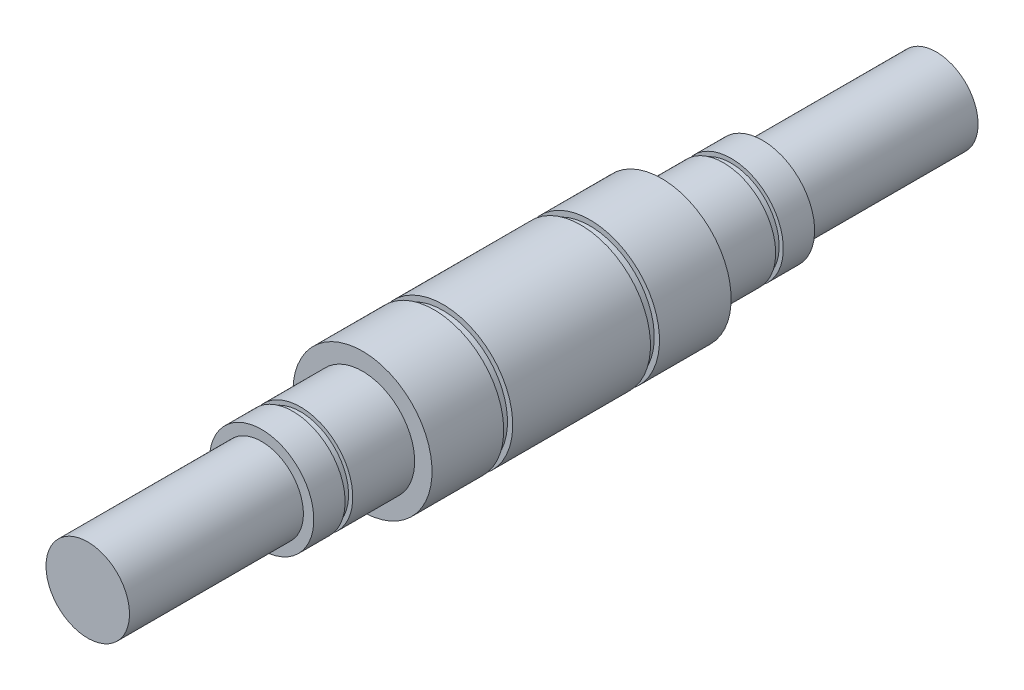
ISO-10303-21;
HEADER;
FILE_DESCRIPTION(('STEP AP214'),'2;1');
FILE_NAME('part.step','',(''),(''),'','','');
FILE_SCHEMA(('AUTOMOTIVE_DESIGN { 1 0 10303 214 1 1 1 1 }'));
ENDSEC;
DATA;
#1=APPLICATION_CONTEXT('core data for automotive mechanical design processes');
#2=APPLICATION_PROTOCOL_DEFINITION('international standard','automotive_design',2000,#1);
#3=PRODUCT_CONTEXT('',#1,'mechanical');
#4=PRODUCT('Part','Part','',(#3));
#5=PRODUCT_RELATED_PRODUCT_CATEGORY('part','',(#4));
#6=PRODUCT_DEFINITION_FORMATION('','',#4);
#7=PRODUCT_DEFINITION_CONTEXT('part definition',#1,'design');
#8=PRODUCT_DEFINITION('design','',#6,#7);
#9=PRODUCT_DEFINITION_SHAPE('','',#8);
#10=(LENGTH_UNIT() NAMED_UNIT(*) SI_UNIT(.MILLI.,.METRE.));
#11=(NAMED_UNIT(*) PLANE_ANGLE_UNIT() SI_UNIT($,.RADIAN.));
#12=(NAMED_UNIT(*) SI_UNIT($,.STERADIAN.) SOLID_ANGLE_UNIT());
#13=UNCERTAINTY_MEASURE_WITH_UNIT(LENGTH_MEASURE(1.E-05),#10,'distance_accuracy_value','');
#14=(GEOMETRIC_REPRESENTATION_CONTEXT(3) GLOBAL_UNCERTAINTY_ASSIGNED_CONTEXT((#13)) GLOBAL_UNIT_ASSIGNED_CONTEXT((#10,
#11,#12)) REPRESENTATION_CONTEXT('',''));
#15=CARTESIAN_POINT('',(0.,0.,0.));
#16=DIRECTION('',(0.,0.,1.));
#17=DIRECTION('',(1.,0.,0.));
#18=AXIS2_PLACEMENT_3D('',#15,#16,#17);
#19=CARTESIAN_POINT('',(0.,0.,61.));
#20=DIRECTION('',(0.,0.,-1.));
#21=DIRECTION('',(-1.,0.,0.));
#22=AXIS2_PLACEMENT_3D('',#19,#20,#21);
#23=CYLINDRICAL_SURFACE('',#22,10.);
#24=CARTESIAN_POINT('',(0.,0.,9.9));
#25=DIRECTION('',(0.,0.,-1.));
#26=DIRECTION('',(-1.,0.,0.));
#27=AXIS2_PLACEMENT_3D('',#24,#25,#26);
#28=CIRCLE('',#27,10.);
#29=CARTESIAN_POINT('',(-10.,0.,9.9));
#30=VERTEX_POINT('',#29);
#31=EDGE_CURVE('E113',#30,#30,#28,.T.);
#32=CARTESIAN_POINT('',(0.,0.,-9.9));
#33=DIRECTION('',(0.,0.,-1.));
#34=DIRECTION('',(-1.,0.,0.));
#35=AXIS2_PLACEMENT_3D('',#32,#33,#34);
#36=CIRCLE('',#35,10.);
#37=CARTESIAN_POINT('',(-10.,0.,-9.90000000000001));
#38=VERTEX_POINT('',#37);
#39=EDGE_CURVE('E101',#38,#38,#36,.T.);
#40=CARTESIAN_POINT('',(-10.,0.,9.9));
#41=CARTESIAN_POINT('',(-10.,0.,9.69375));
#42=CARTESIAN_POINT('',(-10.,0.,9.4875));
#43=CARTESIAN_POINT('',(-10.,0.,9.075));
#44=CARTESIAN_POINT('',(-10.,0.,8.86875));
#45=CARTESIAN_POINT('',(-10.,0.,8.45625));
#46=CARTESIAN_POINT('',(-10.,0.,8.24999999999999));
#47=CARTESIAN_POINT('',(-10.,0.,7.8375));
#48=CARTESIAN_POINT('',(-10.,0.,7.63125));
#49=CARTESIAN_POINT('',(-10.,0.,7.21875));
#50=CARTESIAN_POINT('',(-10.,0.,7.0125));
#51=CARTESIAN_POINT('',(-10.,0.,6.6));
#52=CARTESIAN_POINT('',(-10.,0.,6.39375));
#53=CARTESIAN_POINT('',(-10.,0.,5.98125));
#54=CARTESIAN_POINT('',(-10.,0.,5.775));
#55=CARTESIAN_POINT('',(-10.,0.,5.3625));
#56=CARTESIAN_POINT('',(-10.,0.,5.15625));
#57=CARTESIAN_POINT('',(-10.,0.,4.74375));
#58=CARTESIAN_POINT('',(-10.,0.,4.5375));
#59=CARTESIAN_POINT('',(-10.,0.,4.12499999999999));
#60=CARTESIAN_POINT('',(-10.,0.,3.91874999999999));
#61=CARTESIAN_POINT('',(-10.,0.,3.50624999999999));
#62=CARTESIAN_POINT('',(-10.,0.,3.29999999999999));
#63=CARTESIAN_POINT('',(-10.,0.,2.88749999999999));
#64=CARTESIAN_POINT('',(-10.,0.,2.68125));
#65=CARTESIAN_POINT('',(-10.,0.,2.26875));
#66=CARTESIAN_POINT('',(-10.,0.,2.0625));
#67=CARTESIAN_POINT('',(-10.,0.,1.65));
#68=CARTESIAN_POINT('',(-10.,0.,1.44375));
#69=CARTESIAN_POINT('',(-10.,0.,1.03125));
#70=CARTESIAN_POINT('',(-10.,0.,0.824999999999995));
#71=CARTESIAN_POINT('',(-10.,0.,0.412499999999994));
#72=CARTESIAN_POINT('',(-10.,0.,0.206249999999993));
#73=CARTESIAN_POINT('',(-10.,0.,-0.206250000000007));
#74=CARTESIAN_POINT('',(-10.,0.,-0.412500000000008));
#75=CARTESIAN_POINT('',(-10.,0.,-0.825000000000009));
#76=CARTESIAN_POINT('',(-10.,0.,-1.03125000000001));
#77=CARTESIAN_POINT('',(-10.,0.,-1.44375000000001));
#78=CARTESIAN_POINT('',(-10.,0.,-1.65000000000001));
#79=CARTESIAN_POINT('',(-10.,0.,-2.0625));
#80=CARTESIAN_POINT('',(-10.,0.,-2.26875));
#81=CARTESIAN_POINT('',(-10.,0.,-2.68125000000001));
#82=CARTESIAN_POINT('',(-10.,0.,-2.88750000000001));
#83=CARTESIAN_POINT('',(-10.,0.,-3.30000000000001));
#84=CARTESIAN_POINT('',(-10.,0.,-3.50625000000001));
#85=CARTESIAN_POINT('',(-10.,0.,-3.91875));
#86=CARTESIAN_POINT('',(-10.,0.,-4.125));
#87=CARTESIAN_POINT('',(-10.,0.,-4.5375));
#88=CARTESIAN_POINT('',(-10.,0.,-4.74375));
#89=CARTESIAN_POINT('',(-10.,0.,-5.15625));
#90=CARTESIAN_POINT('',(-10.,0.,-5.3625));
#91=CARTESIAN_POINT('',(-10.,0.,-5.775));
#92=CARTESIAN_POINT('',(-10.,0.,-5.98125));
#93=CARTESIAN_POINT('',(-10.,0.,-6.39375));
#94=CARTESIAN_POINT('',(-10.,0.,-6.6));
#95=CARTESIAN_POINT('',(-10.,0.,-7.0125));
#96=CARTESIAN_POINT('',(-10.,0.,-7.21875));
#97=CARTESIAN_POINT('',(-10.,0.,-7.63125));
#98=CARTESIAN_POINT('',(-10.,0.,-7.8375));
#99=CARTESIAN_POINT('',(-10.,0.,-8.25));
#100=CARTESIAN_POINT('',(-10.,0.,-8.45625));
#101=CARTESIAN_POINT('',(-10.,0.,-8.86875));
#102=CARTESIAN_POINT('',(-10.,0.,-9.075));
#103=CARTESIAN_POINT('',(-10.,0.,-9.4875));
#104=CARTESIAN_POINT('',(-10.,0.,-9.69375000000001));
#105=CARTESIAN_POINT('',(-10.,0.,-9.90000000000001));
#106=B_SPLINE_CURVE_WITH_KNOTS('',3,(#40,#41,#42,#43,#44,#45,#46,#47,#48,#49,#50,#51,#52,#53,
#54,#55,#56,#57,#58,#59,#60,#61,#62,#63,#64,#65,#66,#67,#68,#69,#70,#71,#72,#73,#74,#75,#76,#77,
#78,#79,#80,#81,#82,#83,#84,#85,#86,#87,#88,#89,#90,#91,#92,#93,#94,#95,#96,#97,#98,#99,#100,
#101,#102,#103,#104,#105),.UNSPECIFIED.,.F.,.F.,(4,2,2,2,2,2,2,2,2,2,2,2,2,2,2,2,2,2,2,2,2,2,2,
2,2,2,2,2,2,2,2,2,4),(0.,0.618750000000001,1.2375,1.85625,2.475,3.09375,3.7125,4.33125,4.95,
5.56875,6.18750000000001,6.80625000000001,7.425,8.04375,8.6625,9.28125000000001,
9.90000000000001,10.51875,11.1375,11.75625,12.375,12.99375,13.6125,14.23125,14.85,15.46875,
16.0875,16.70625,17.325,17.94375,18.5625,19.18125,19.8),.UNSPECIFIED.);
#107=EDGE_CURVE('BSEAM30',#30,#38,#106,.T.);
#108=ORIENTED_EDGE('',*,*,#31,.T.);
#109=ORIENTED_EDGE('',*,*,#39,.F.);
#110=ORIENTED_EDGE('',*,*,#107,.T.);
#111=ORIENTED_EDGE('',*,*,#107,.F.);
#112=EDGE_LOOP('',(#108,#110,#109,#111));
#113=FACE_BOUND('',#112,.T.);
#114=ADVANCED_FACE('F30',(#113),#23,.T.);
#115=CARTESIAN_POINT('',(0.,10.,-9.9));
#116=DIRECTION('',(0.,0.,1.));
#117=DIRECTION('',(1.,0.,0.));
#118=AXIS2_PLACEMENT_3D('',#115,#116,#117);
#119=PLANE('',#118);
#120=CARTESIAN_POINT('',(0.,0.,-9.9));
#121=DIRECTION('',(0.,0.,-1.));
#122=DIRECTION('',(-1.,0.,0.));
#123=AXIS2_PLACEMENT_3D('',#120,#121,#122);
#124=CIRCLE('',#123,9.25);
#125=CARTESIAN_POINT('',(-9.25,0.,-9.9));
#126=VERTEX_POINT('',#125);
#127=EDGE_CURVE('E92',#126,#126,#124,.T.);
#128=ORIENTED_EDGE('',*,*,#127,.F.);
#129=EDGE_LOOP('',(#128));
#130=FACE_BOUND('',#129,.T.);
#131=ORIENTED_EDGE('',*,*,#39,.T.);
#132=EDGE_LOOP('',(#131));
#133=FACE_BOUND('',#132,.T.);
#134=ADVANCED_FACE('F136',(#130,#133),#119,.F.);
#135=CARTESIAN_POINT('',(0.,0.,-67.1));
#136=DIRECTION('',(0.,0.,-1.));
#137=DIRECTION('',(-1.,0.,0.));
#138=AXIS2_PLACEMENT_3D('',#135,#136,#137);
#139=CYLINDRICAL_SURFACE('',#138,9.25);
#140=CARTESIAN_POINT('',(0.,0.,-11.2));
#141=DIRECTION('',(0.,0.,-1.));
#142=DIRECTION('',(-1.,0.,0.));
#143=AXIS2_PLACEMENT_3D('',#140,#141,#142);
#144=CIRCLE('',#143,9.25);
#145=CARTESIAN_POINT('',(-9.25,0.,-11.2));
#146=VERTEX_POINT('',#145);
#147=EDGE_CURVE('E95',#146,#146,#144,.T.);
#148=ORIENTED_EDGE('',*,*,#147,.F.);
#149=EDGE_LOOP('',(#148));
#150=FACE_BOUND('',#149,.T.);
#151=ORIENTED_EDGE('',*,*,#127,.T.);
#152=EDGE_LOOP('',(#151));
#153=FACE_BOUND('',#152,.T.);
#154=ADVANCED_FACE('F140',(#150,#153),#139,.T.);
#155=CARTESIAN_POINT('',(0.,10.,-11.2));
#156=DIRECTION('',(0.,0.,-1.));
#157=DIRECTION('',(-1.,0.,0.));
#158=AXIS2_PLACEMENT_3D('',#155,#156,#157);
#159=PLANE('',#158);
#160=CARTESIAN_POINT('',(0.,0.,-11.2));
#161=DIRECTION('',(0.,0.,-1.));
#162=DIRECTION('',(-1.,0.,0.));
#163=AXIS2_PLACEMENT_3D('',#160,#161,#162);
#164=CIRCLE('',#163,10.);
#165=CARTESIAN_POINT('',(-10.,0.,-11.2));
#166=VERTEX_POINT('',#165);
#167=EDGE_CURVE('E98',#166,#166,#164,.T.);
#168=ORIENTED_EDGE('',*,*,#167,.F.);
#169=EDGE_LOOP('',(#168));
#170=FACE_BOUND('',#169,.T.);
#171=ORIENTED_EDGE('',*,*,#147,.T.);
#172=EDGE_LOOP('',(#171));
#173=FACE_BOUND('',#172,.T.);
#174=ADVANCED_FACE('F182',(#170,#173),#159,.F.);
#175=CARTESIAN_POINT('',(0.,0.,-61.));
#176=DIRECTION('',(0.,0.,1.));
#177=DIRECTION('',(1.,0.,0.));
#178=AXIS2_PLACEMENT_3D('',#175,#176,#177);
#179=PLANE('',#178);
#180=CARTESIAN_POINT('',(0.,0.,-61.));
#181=DIRECTION('',(0.,0.,-1.));
#182=DIRECTION('',(-1.,0.,0.));
#183=AXIS2_PLACEMENT_3D('',#180,#181,#182);
#184=CIRCLE('',#183,6.);
#185=CARTESIAN_POINT('',(-6.,0.,-61.));
#186=VERTEX_POINT('',#185);
#187=EDGE_CURVE('E53',#186,#186,#184,.T.);
#188=ORIENTED_EDGE('',*,*,#187,.T.);
#189=EDGE_LOOP('',(#188));
#190=FACE_BOUND('',#189,.T.);
#191=ADVANCED_FACE('F179',(#190),#179,.F.);
#192=CARTESIAN_POINT('',(0.,0.,-67.1));
#193=DIRECTION('',(0.,0.,-1.));
#194=DIRECTION('',(-1.,0.,0.));
#195=AXIS2_PLACEMENT_3D('',#192,#193,#194);
#196=CYLINDRICAL_SURFACE('',#195,6.);
#197=ORIENTED_EDGE('',*,*,#187,.F.);
#198=EDGE_LOOP('',(#197));
#199=FACE_BOUND('',#198,.T.);
#200=CARTESIAN_POINT('',(0.,0.,-36.));
#201=DIRECTION('',(0.,0.,-1.));
#202=DIRECTION('',(-1.,0.,0.));
#203=AXIS2_PLACEMENT_3D('',#200,#201,#202);
#204=CIRCLE('',#203,6.);
#205=CARTESIAN_POINT('',(-6.,0.,-36.));
#206=VERTEX_POINT('',#205);
#207=EDGE_CURVE('E50',#206,#206,#204,.T.);
#208=ORIENTED_EDGE('',*,*,#207,.T.);
#209=EDGE_LOOP('',(#208));
#210=FACE_BOUND('',#209,.T.);
#211=ADVANCED_FACE('F181',(#199,#210),#196,.T.);
#212=CARTESIAN_POINT('',(0.,7.5,-36.));
#213=DIRECTION('',(0.,0.,1.));
#214=DIRECTION('',(1.,0.,0.));
#215=AXIS2_PLACEMENT_3D('',#212,#213,#214);
#216=PLANE('',#215);
#217=ORIENTED_EDGE('',*,*,#207,.F.);
#218=EDGE_LOOP('',(#217));
#219=FACE_BOUND('',#218,.T.);
#220=CARTESIAN_POINT('',(0.,0.,-36.));
#221=DIRECTION('',(0.,0.,-1.));
#222=DIRECTION('',(-1.,0.,0.));
#223=AXIS2_PLACEMENT_3D('',#220,#221,#222);
#224=CIRCLE('',#223,7.5);
#225=CARTESIAN_POINT('',(-7.5,0.,-36.));
#226=VERTEX_POINT('',#225);
#227=EDGE_CURVE('E56',#226,#226,#224,.T.);
#228=ORIENTED_EDGE('',*,*,#227,.T.);
#229=EDGE_LOOP('',(#228));
#230=FACE_BOUND('',#229,.T.);
#231=ADVANCED_FACE('F188',(#219,#230),#216,.F.);
#232=CARTESIAN_POINT('',(0.,0.,-67.1));
#233=DIRECTION('',(0.,0.,-1.));
#234=DIRECTION('',(-1.,0.,0.));
#235=AXIS2_PLACEMENT_3D('',#232,#233,#234);
#236=CYLINDRICAL_SURFACE('',#235,7.5);
#237=CARTESIAN_POINT('',(0.,0.,-31.5));
#238=DIRECTION('',(0.,0.,-1.));
#239=DIRECTION('',(-1.,0.,0.));
#240=AXIS2_PLACEMENT_3D('',#237,#238,#239);
#241=CIRCLE('',#240,7.5);
#242=CARTESIAN_POINT('',(-7.5,0.,-31.5));
#243=VERTEX_POINT('',#242);
#244=EDGE_CURVE('E74',#243,#243,#241,.T.);
#245=ORIENTED_EDGE('',*,*,#244,.T.);
#246=EDGE_LOOP('',(#245));
#247=FACE_BOUND('',#246,.T.);
#248=ORIENTED_EDGE('',*,*,#227,.F.);
#249=EDGE_LOOP('',(#248));
#250=FACE_BOUND('',#249,.T.);
#251=ADVANCED_FACE('F198',(#247,#250),#236,.T.);
#252=CARTESIAN_POINT('',(0.,7.5,-31.5));
#253=DIRECTION('',(0.,0.,-1.));
#254=DIRECTION('',(-1.,0.,0.));
#255=AXIS2_PLACEMENT_3D('',#252,#253,#254);
#256=PLANE('',#255);
#257=ORIENTED_EDGE('',*,*,#244,.F.);
#258=EDGE_LOOP('',(#257));
#259=FACE_BOUND('',#258,.T.);
#260=CARTESIAN_POINT('',(0.,0.,-31.5));
#261=DIRECTION('',(0.,0.,-1.));
#262=DIRECTION('',(-1.,0.,0.));
#263=AXIS2_PLACEMENT_3D('',#260,#261,#262);
#264=CIRCLE('',#263,6.9);
#265=CARTESIAN_POINT('',(-6.9,0.,-31.5));
#266=VERTEX_POINT('',#265);
#267=EDGE_CURVE('E71',#266,#266,#264,.T.);
#268=ORIENTED_EDGE('',*,*,#267,.T.);
#269=EDGE_LOOP('',(#268));
#270=FACE_BOUND('',#269,.T.);
#271=ADVANCED_FACE('F203',(#259,#270),#256,.F.);
#272=CARTESIAN_POINT('',(0.,0.,-67.1));
#273=DIRECTION('',(0.,0.,-1.));
#274=DIRECTION('',(-1.,0.,0.));
#275=AXIS2_PLACEMENT_3D('',#272,#273,#274);
#276=CYLINDRICAL_SURFACE('',#275,6.9);
#277=ORIENTED_EDGE('',*,*,#267,.F.);
#278=EDGE_LOOP('',(#277));
#279=FACE_BOUND('',#278,.T.);
#280=CARTESIAN_POINT('',(0.,0.,-30.4));
#281=DIRECTION('',(0.,0.,-1.));
#282=DIRECTION('',(-1.,0.,0.));
#283=AXIS2_PLACEMENT_3D('',#280,#281,#282);
#284=CIRCLE('',#283,6.9);
#285=CARTESIAN_POINT('',(-6.9,0.,-30.4));
#286=VERTEX_POINT('',#285);
#287=EDGE_CURVE('E68',#286,#286,#284,.T.);
#288=ORIENTED_EDGE('',*,*,#287,.T.);
#289=EDGE_LOOP('',(#288));
#290=FACE_BOUND('',#289,.T.);
#291=ADVANCED_FACE('F209',(#279,#290),#276,.T.);
#292=CARTESIAN_POINT('',(0.,7.5,-30.4));
#293=DIRECTION('',(0.,0.,1.));
#294=DIRECTION('',(1.,0.,0.));
#295=AXIS2_PLACEMENT_3D('',#292,#293,#294);
#296=PLANE('',#295);
#297=ORIENTED_EDGE('',*,*,#287,.F.);
#298=EDGE_LOOP('',(#297));
#299=FACE_BOUND('',#298,.T.);
#300=CARTESIAN_POINT('',(0.,0.,-30.4));
#301=DIRECTION('',(0.,0.,-1.));
#302=DIRECTION('',(-1.,0.,0.));
#303=AXIS2_PLACEMENT_3D('',#300,#301,#302);
#304=CIRCLE('',#303,7.5);
#305=CARTESIAN_POINT('',(-7.5,0.,-30.4));
#306=VERTEX_POINT('',#305);
#307=EDGE_CURVE('E77',#306,#306,#304,.T.);
#308=ORIENTED_EDGE('',*,*,#307,.T.);
#309=EDGE_LOOP('',(#308));
#310=FACE_BOUND('',#309,.T.);
#311=ADVANCED_FACE('F213',(#299,#310),#296,.F.);
#312=ORIENTED_EDGE('',*,*,#307,.F.);
#313=EDGE_LOOP('',(#312));
#314=FACE_BOUND('',#313,.T.);
#315=CARTESIAN_POINT('',(0.,0.,-21.5));
#316=DIRECTION('',(0.,0.,-1.));
#317=DIRECTION('',(-1.,0.,0.));
#318=AXIS2_PLACEMENT_3D('',#315,#316,#317);
#319=CIRCLE('',#318,7.5);
#320=CARTESIAN_POINT('',(-7.5,0.,-21.5));
#321=VERTEX_POINT('',#320);
#322=EDGE_CURVE('E10',#321,#321,#319,.T.);
#323=ORIENTED_EDGE('',*,*,#322,.T.);
#324=EDGE_LOOP('',(#323));
#325=FACE_BOUND('',#324,.T.);
#326=ADVANCED_FACE('F205',(#314,#325),#236,.T.);
#327=CARTESIAN_POINT('',(0.,10.,-21.5));
#328=DIRECTION('',(0.,0.,1.));
#329=DIRECTION('',(1.,0.,0.));
#330=AXIS2_PLACEMENT_3D('',#327,#328,#329);
#331=PLANE('',#330);
#332=ORIENTED_EDGE('',*,*,#322,.F.);
#333=EDGE_LOOP('',(#332));
#334=FACE_BOUND('',#333,.T.);
#335=CARTESIAN_POINT('',(0.,0.,-21.5));
#336=DIRECTION('',(0.,0.,-1.));
#337=DIRECTION('',(-1.,0.,0.));
#338=AXIS2_PLACEMENT_3D('',#335,#336,#337);
#339=CIRCLE('',#338,10.);
#340=CARTESIAN_POINT('',(-10.,0.,-21.5));
#341=VERTEX_POINT('',#340);
#342=EDGE_CURVE('E37',#341,#341,#339,.T.);
#343=ORIENTED_EDGE('',*,*,#342,.T.);
#344=EDGE_LOOP('',(#343));
#345=FACE_BOUND('',#344,.T.);
#346=ADVANCED_FACE('F131',(#334,#345),#331,.F.);
#347=CARTESIAN_POINT('',(-10.,0.,-11.2));
#348=CARTESIAN_POINT('',(-10.,0.,-11.3072916666667));
#349=CARTESIAN_POINT('',(-10.,0.,-11.4145833333333));
#350=CARTESIAN_POINT('',(-10.,0.,-11.6291666666667));
#351=CARTESIAN_POINT('',(-10.,0.,-11.7364583333333));
#352=CARTESIAN_POINT('',(-10.,0.,-11.9510416666667));
#353=CARTESIAN_POINT('',(-10.,0.,-12.0583333333333));
#354=CARTESIAN_POINT('',(-10.,0.,-12.2729166666667));
#355=CARTESIAN_POINT('',(-10.,0.,-12.3802083333333));
#356=CARTESIAN_POINT('',(-10.,0.,-12.5947916666667));
#357=CARTESIAN_POINT('',(-10.,0.,-12.7020833333333));
#358=CARTESIAN_POINT('',(-10.,0.,-12.9166666666667));
#359=CARTESIAN_POINT('',(-10.,0.,-13.0239583333333));
#360=CARTESIAN_POINT('',(-10.,0.,-13.2385416666667));
#361=CARTESIAN_POINT('',(-10.,0.,-13.3458333333333));
#362=CARTESIAN_POINT('',(-10.,0.,-13.5604166666667));
#363=CARTESIAN_POINT('',(-10.,0.,-13.6677083333333));
#364=CARTESIAN_POINT('',(-10.,0.,-13.8822916666667));
#365=CARTESIAN_POINT('',(-10.,0.,-13.9895833333333));
#366=CARTESIAN_POINT('',(-10.,0.,-14.2041666666667));
#367=CARTESIAN_POINT('',(-10.,0.,-14.3114583333333));
#368=CARTESIAN_POINT('',(-10.,0.,-14.5260416666667));
#369=CARTESIAN_POINT('',(-10.,0.,-14.6333333333333));
#370=CARTESIAN_POINT('',(-10.,0.,-14.8479166666667));
#371=CARTESIAN_POINT('',(-10.,0.,-14.9552083333333));
#372=CARTESIAN_POINT('',(-10.,0.,-15.1697916666667));
#373=CARTESIAN_POINT('',(-10.,0.,-15.2770833333333));
#374=CARTESIAN_POINT('',(-10.,0.,-15.4916666666667));
#375=CARTESIAN_POINT('',(-10.,0.,-15.5989583333333));
#376=CARTESIAN_POINT('',(-10.,0.,-15.8135416666667));
#377=CARTESIAN_POINT('',(-10.,0.,-15.9208333333333));
#378=CARTESIAN_POINT('',(-10.,0.,-16.1354166666667));
#379=CARTESIAN_POINT('',(-10.,0.,-16.2427083333333));
#380=CARTESIAN_POINT('',(-10.,0.,-16.4572916666667));
#381=CARTESIAN_POINT('',(-10.,0.,-16.5645833333333));
#382=CARTESIAN_POINT('',(-10.,0.,-16.7791666666667));
#383=CARTESIAN_POINT('',(-10.,0.,-16.8864583333333));
#384=CARTESIAN_POINT('',(-10.,0.,-17.1010416666667));
#385=CARTESIAN_POINT('',(-10.,0.,-17.2083333333333));
#386=CARTESIAN_POINT('',(-10.,0.,-17.4229166666667));
#387=CARTESIAN_POINT('',(-10.,0.,-17.5302083333333));
#388=CARTESIAN_POINT('',(-10.,0.,-17.7447916666667));
#389=CARTESIAN_POINT('',(-10.,0.,-17.8520833333333));
#390=CARTESIAN_POINT('',(-10.,0.,-18.0666666666667));
#391=CARTESIAN_POINT('',(-10.,0.,-18.1739583333333));
#392=CARTESIAN_POINT('',(-10.,0.,-18.3885416666667));
#393=CARTESIAN_POINT('',(-10.,0.,-18.4958333333333));
#394=CARTESIAN_POINT('',(-10.,0.,-18.7104166666667));
#395=CARTESIAN_POINT('',(-10.,0.,-18.8177083333333));
#396=CARTESIAN_POINT('',(-10.,0.,-19.0322916666667));
#397=CARTESIAN_POINT('',(-10.,0.,-19.1395833333333));
#398=CARTESIAN_POINT('',(-10.,0.,-19.3541666666667));
#399=CARTESIAN_POINT('',(-10.,0.,-19.4614583333333));
#400=CARTESIAN_POINT('',(-10.,0.,-19.6760416666667));
#401=CARTESIAN_POINT('',(-10.,0.,-19.7833333333333));
#402=CARTESIAN_POINT('',(-10.,0.,-19.9979166666667));
#403=CARTESIAN_POINT('',(-10.,0.,-20.1052083333333));
#404=CARTESIAN_POINT('',(-10.,0.,-20.3197916666667));
#405=CARTESIAN_POINT('',(-10.,0.,-20.4270833333333));
#406=CARTESIAN_POINT('',(-10.,0.,-20.6416666666667));
#407=CARTESIAN_POINT('',(-10.,0.,-20.7489583333333));
#408=CARTESIAN_POINT('',(-10.,0.,-20.9635416666667));
#409=CARTESIAN_POINT('',(-10.,0.,-21.0708333333333));
#410=CARTESIAN_POINT('',(-10.,0.,-21.2854166666667));
#411=CARTESIAN_POINT('',(-10.,0.,-21.3927083333333));
#412=CARTESIAN_POINT('',(-10.,0.,-21.5));
#413=B_SPLINE_CURVE_WITH_KNOTS('',3,(#347,#348,#349,#350,#351,#352,#353,#354,#355,#356,#357,
#358,#359,#360,#361,#362,#363,#364,#365,#366,#367,#368,#369,#370,#371,#372,#373,#374,#375,#376,
#377,#378,#379,#380,#381,#382,#383,#384,#385,#386,#387,#388,#389,#390,#391,#392,#393,#394,#395,
#396,#397,#398,#399,#400,#401,#402,#403,#404,#405,#406,#407,#408,#409,#410,#411,#412),
.UNSPECIFIED.,.F.,.F.,(4,2,2,2,2,2,2,2,2,2,2,2,2,2,2,2,2,2,2,2,2,2,2,2,2,2,2,2,2,2,2,2,4),(0.,
0.321874999999999,0.643749999999998,0.965624999999998,1.2875,1.609375,1.93125,2.25312499999999,
2.57499999999999,2.89687500000001,3.21875000000001,3.54062500000001,3.8625,4.184375,4.50625,
4.828125,5.15,5.471875,5.79375,6.115625,6.4375,6.759375,7.08125,7.403125,7.72500000000001,
8.04687500000001,8.36875000000001,8.69062500000001,9.01250000000001,9.334375,9.65625000000001,
9.978125,10.3),.UNSPECIFIED.);
#414=EDGE_CURVE('BSEAM32',#166,#341,#413,.T.);
#415=ORIENTED_EDGE('',*,*,#167,.T.);
#416=ORIENTED_EDGE('',*,*,#342,.F.);
#417=ORIENTED_EDGE('',*,*,#414,.T.);
#418=ORIENTED_EDGE('',*,*,#414,.F.);
#419=EDGE_LOOP('',(#415,#417,#416,#418));
#420=FACE_BOUND('',#419,.T.);
#421=ADVANCED_FACE('F32',(#420),#23,.T.);
#422=CARTESIAN_POINT('',(0.,10.,9.9));
#423=DIRECTION('',(0.,0.,-1.));
#424=DIRECTION('',(1.,0.,0.));
#425=AXIS2_PLACEMENT_3D('',#422,#423,#424);
#426=PLANE('',#425);
#427=CARTESIAN_POINT('',(0.,0.,9.9));
#428=DIRECTION('',(0.,0.,-1.));
#429=DIRECTION('',(-1.,0.,0.));
#430=AXIS2_PLACEMENT_3D('',#427,#428,#429);
#431=CIRCLE('',#430,9.25);
#432=CARTESIAN_POINT('',(-9.25,0.,9.9));
#433=VERTEX_POINT('',#432);
#434=EDGE_CURVE('E104',#433,#433,#431,.T.);
#435=ORIENTED_EDGE('',*,*,#434,.T.);
#436=EDGE_LOOP('',(#435));
#437=FACE_BOUND('',#436,.T.);
#438=ORIENTED_EDGE('',*,*,#31,.F.);
#439=EDGE_LOOP('',(#438));
#440=FACE_BOUND('',#439,.T.);
#441=ADVANCED_FACE('F119',(#437,#440),#426,.F.);
#442=CARTESIAN_POINT('',(0.,0.,67.1));
#443=DIRECTION('',(0.,0.,1.));
#444=DIRECTION('',(-1.,0.,0.));
#445=AXIS2_PLACEMENT_3D('',#442,#443,#444);
#446=CYLINDRICAL_SURFACE('',#445,9.25);
#447=CARTESIAN_POINT('',(0.,0.,11.2));
#448=DIRECTION('',(0.,0.,-1.));
#449=DIRECTION('',(-1.,0.,0.));
#450=AXIS2_PLACEMENT_3D('',#447,#448,#449);
#451=CIRCLE('',#450,9.25);
#452=CARTESIAN_POINT('',(-9.25,0.,11.2));
#453=VERTEX_POINT('',#452);
#454=EDGE_CURVE('E107',#453,#453,#451,.T.);
#455=ORIENTED_EDGE('',*,*,#454,.T.);
#456=EDGE_LOOP('',(#455));
#457=FACE_BOUND('',#456,.T.);
#458=ORIENTED_EDGE('',*,*,#434,.F.);
#459=EDGE_LOOP('',(#458));
#460=FACE_BOUND('',#459,.T.);
#461=ADVANCED_FACE('F121',(#457,#460),#446,.T.);
#462=CARTESIAN_POINT('',(0.,10.,11.2));
#463=DIRECTION('',(0.,0.,1.));
#464=DIRECTION('',(-1.,0.,0.));
#465=AXIS2_PLACEMENT_3D('',#462,#463,#464);
#466=PLANE('',#465);
#467=CARTESIAN_POINT('',(0.,0.,11.2));
#468=DIRECTION('',(0.,0.,-1.));
#469=DIRECTION('',(-1.,0.,0.));
#470=AXIS2_PLACEMENT_3D('',#467,#468,#469);
#471=CIRCLE('',#470,10.);
#472=CARTESIAN_POINT('',(-10.,0.,11.2));
#473=VERTEX_POINT('',#472);
#474=EDGE_CURVE('E110',#473,#473,#471,.T.);
#475=ORIENTED_EDGE('',*,*,#474,.T.);
#476=EDGE_LOOP('',(#475));
#477=FACE_BOUND('',#476,.T.);
#478=ORIENTED_EDGE('',*,*,#454,.F.);
#479=EDGE_LOOP('',(#478));
#480=FACE_BOUND('',#479,.T.);
#481=ADVANCED_FACE('F128',(#477,#480),#466,.F.);
#482=CARTESIAN_POINT('',(0.,0.,61.));
#483=DIRECTION('',(0.,0.,1.));
#484=DIRECTION('',(1.,0.,0.));
#485=AXIS2_PLACEMENT_3D('',#482,#483,#484);
#486=PLANE('',#485);
#487=CARTESIAN_POINT('',(0.,0.,61.));
#488=DIRECTION('',(0.,0.,-1.));
#489=DIRECTION('',(-1.,0.,0.));
#490=AXIS2_PLACEMENT_3D('',#487,#488,#489);
#491=CIRCLE('',#490,6.);
#492=CARTESIAN_POINT('',(-6.,0.,61.));
#493=VERTEX_POINT('',#492);
#494=EDGE_CURVE('E62',#493,#493,#491,.T.);
#495=ORIENTED_EDGE('',*,*,#494,.F.);
#496=EDGE_LOOP('',(#495));
#497=FACE_BOUND('',#496,.T.);
#498=ADVANCED_FACE('F159',(#497),#486,.T.);
#499=CARTESIAN_POINT('',(0.,0.,67.1));
#500=DIRECTION('',(0.,0.,1.));
#501=DIRECTION('',(-1.,0.,0.));
#502=AXIS2_PLACEMENT_3D('',#499,#500,#501);
#503=CYLINDRICAL_SURFACE('',#502,6.);
#504=ORIENTED_EDGE('',*,*,#494,.T.);
#505=EDGE_LOOP('',(#504));
#506=FACE_BOUND('',#505,.T.);
#507=CARTESIAN_POINT('',(0.,0.,36.));
#508=DIRECTION('',(0.,0.,-1.));
#509=DIRECTION('',(-1.,0.,0.));
#510=AXIS2_PLACEMENT_3D('',#507,#508,#509);
#511=CIRCLE('',#510,6.);
#512=CARTESIAN_POINT('',(-6.,0.,36.));
#513=VERTEX_POINT('',#512);
#514=EDGE_CURVE('E59',#513,#513,#511,.T.);
#515=ORIENTED_EDGE('',*,*,#514,.F.);
#516=EDGE_LOOP('',(#515));
#517=FACE_BOUND('',#516,.T.);
#518=ADVANCED_FACE('F167',(#506,#517),#503,.T.);
#519=CARTESIAN_POINT('',(0.,7.5,36.));
#520=DIRECTION('',(0.,0.,-1.));
#521=DIRECTION('',(1.,0.,0.));
#522=AXIS2_PLACEMENT_3D('',#519,#520,#521);
#523=PLANE('',#522);
#524=ORIENTED_EDGE('',*,*,#514,.T.);
#525=EDGE_LOOP('',(#524));
#526=FACE_BOUND('',#525,.T.);
#527=CARTESIAN_POINT('',(0.,0.,36.));
#528=DIRECTION('',(0.,0.,-1.));
#529=DIRECTION('',(-1.,0.,0.));
#530=AXIS2_PLACEMENT_3D('',#527,#528,#529);
#531=CIRCLE('',#530,7.5);
#532=CARTESIAN_POINT('',(-7.5,0.,36.));
#533=VERTEX_POINT('',#532);
#534=EDGE_CURVE('E65',#533,#533,#531,.T.);
#535=ORIENTED_EDGE('',*,*,#534,.F.);
#536=EDGE_LOOP('',(#535));
#537=FACE_BOUND('',#536,.T.);
#538=ADVANCED_FACE('F173',(#526,#537),#523,.F.);
#539=CARTESIAN_POINT('',(0.,0.,67.1));
#540=DIRECTION('',(0.,0.,1.));
#541=DIRECTION('',(-1.,0.,0.));
#542=AXIS2_PLACEMENT_3D('',#539,#540,#541);
#543=CYLINDRICAL_SURFACE('',#542,7.5);
#544=CARTESIAN_POINT('',(0.,0.,31.5));
#545=DIRECTION('',(0.,0.,-1.));
#546=DIRECTION('',(-1.,0.,0.));
#547=AXIS2_PLACEMENT_3D('',#544,#545,#546);
#548=CIRCLE('',#547,7.5);
#549=CARTESIAN_POINT('',(-7.5,0.,31.5));
#550=VERTEX_POINT('',#549);
#551=EDGE_CURVE('E86',#550,#550,#548,.T.);
#552=ORIENTED_EDGE('',*,*,#551,.F.);
#553=EDGE_LOOP('',(#552));
#554=FACE_BOUND('',#553,.T.);
#555=ORIENTED_EDGE('',*,*,#534,.T.);
#556=EDGE_LOOP('',(#555));
#557=FACE_BOUND('',#556,.T.);
#558=ADVANCED_FACE('F232',(#554,#557),#543,.T.);
#559=CARTESIAN_POINT('',(0.,7.5,31.5));
#560=DIRECTION('',(0.,0.,1.));
#561=DIRECTION('',(-1.,0.,0.));
#562=AXIS2_PLACEMENT_3D('',#559,#560,#561);
#563=PLANE('',#562);
#564=ORIENTED_EDGE('',*,*,#551,.T.);
#565=EDGE_LOOP('',(#564));
#566=FACE_BOUND('',#565,.T.);
#567=CARTESIAN_POINT('',(0.,0.,31.5));
#568=DIRECTION('',(0.,0.,-1.));
#569=DIRECTION('',(-1.,0.,0.));
#570=AXIS2_PLACEMENT_3D('',#567,#568,#569);
#571=CIRCLE('',#570,6.9);
#572=CARTESIAN_POINT('',(-6.9,0.,31.5));
#573=VERTEX_POINT('',#572);
#574=EDGE_CURVE('E83',#573,#573,#571,.T.);
#575=ORIENTED_EDGE('',*,*,#574,.F.);
#576=EDGE_LOOP('',(#575));
#577=FACE_BOUND('',#576,.T.);
#578=ADVANCED_FACE('F236',(#566,#577),#563,.F.);
#579=CARTESIAN_POINT('',(0.,0.,67.1));
#580=DIRECTION('',(0.,0.,1.));
#581=DIRECTION('',(-1.,0.,0.));
#582=AXIS2_PLACEMENT_3D('',#579,#580,#581);
#583=CYLINDRICAL_SURFACE('',#582,6.9);
#584=ORIENTED_EDGE('',*,*,#574,.T.);
#585=EDGE_LOOP('',(#584));
#586=FACE_BOUND('',#585,.T.);
#587=CARTESIAN_POINT('',(0.,0.,30.4));
#588=DIRECTION('',(0.,0.,-1.));
#589=DIRECTION('',(-1.,0.,0.));
#590=AXIS2_PLACEMENT_3D('',#587,#588,#589);
#591=CIRCLE('',#590,6.9);
#592=CARTESIAN_POINT('',(-6.9,0.,30.4));
#593=VERTEX_POINT('',#592);
#594=EDGE_CURVE('E80',#593,#593,#591,.T.);
#595=ORIENTED_EDGE('',*,*,#594,.F.);
#596=EDGE_LOOP('',(#595));
#597=FACE_BOUND('',#596,.T.);
#598=ADVANCED_FACE('F241',(#586,#597),#583,.T.);
#599=CARTESIAN_POINT('',(0.,7.5,30.4));
#600=DIRECTION('',(0.,0.,-1.));
#601=DIRECTION('',(1.,0.,0.));
#602=AXIS2_PLACEMENT_3D('',#599,#600,#601);
#603=PLANE('',#602);
#604=ORIENTED_EDGE('',*,*,#594,.T.);
#605=EDGE_LOOP('',(#604));
#606=FACE_BOUND('',#605,.T.);
#607=CARTESIAN_POINT('',(0.,0.,30.4));
#608=DIRECTION('',(0.,0.,-1.));
#609=DIRECTION('',(-1.,0.,0.));
#610=AXIS2_PLACEMENT_3D('',#607,#608,#609);
#611=CIRCLE('',#610,7.5);
#612=CARTESIAN_POINT('',(-7.5,0.,30.4));
#613=VERTEX_POINT('',#612);
#614=EDGE_CURVE('E89',#613,#613,#611,.T.);
#615=ORIENTED_EDGE('',*,*,#614,.F.);
#616=EDGE_LOOP('',(#615));
#617=FACE_BOUND('',#616,.T.);
#618=ADVANCED_FACE('F247',(#606,#617),#603,.F.);
#619=ORIENTED_EDGE('',*,*,#614,.T.);
#620=EDGE_LOOP('',(#619));
#621=FACE_BOUND('',#620,.T.);
#622=CARTESIAN_POINT('',(0.,0.,21.5));
#623=DIRECTION('',(0.,0.,-1.));
#624=DIRECTION('',(-1.,0.,0.));
#625=AXIS2_PLACEMENT_3D('',#622,#623,#624);
#626=CIRCLE('',#625,7.5);
#627=CARTESIAN_POINT('',(-7.5,0.,21.5));
#628=VERTEX_POINT('',#627);
#629=EDGE_CURVE('E41',#628,#628,#626,.T.);
#630=ORIENTED_EDGE('',*,*,#629,.F.);
#631=EDGE_LOOP('',(#630));
#632=FACE_BOUND('',#631,.T.);
#633=ADVANCED_FACE('F149',(#621,#632),#543,.T.);
#634=CARTESIAN_POINT('',(0.,10.,21.5));
#635=DIRECTION('',(0.,0.,-1.));
#636=DIRECTION('',(1.,0.,0.));
#637=AXIS2_PLACEMENT_3D('',#634,#635,#636);
#638=PLANE('',#637);
#639=ORIENTED_EDGE('',*,*,#629,.T.);
#640=EDGE_LOOP('',(#639));
#641=FACE_BOUND('',#640,.T.);
#642=CARTESIAN_POINT('',(0.,0.,21.5));
#643=DIRECTION('',(0.,0.,-1.));
#644=DIRECTION('',(-1.,0.,0.));
#645=AXIS2_PLACEMENT_3D('',#642,#643,#644);
#646=CIRCLE('',#645,10.);
#647=CARTESIAN_POINT('',(-10.,0.,21.5));
#648=VERTEX_POINT('',#647);
#649=EDGE_CURVE('E45',#648,#648,#646,.T.);
#650=ORIENTED_EDGE('',*,*,#649,.F.);
#651=EDGE_LOOP('',(#650));
#652=FACE_BOUND('',#651,.T.);
#653=ADVANCED_FACE('F144',(#641,#652),#638,.F.);
#654=CARTESIAN_POINT('',(-10.,0.,11.2));
#655=CARTESIAN_POINT('',(-10.,0.,11.3072916666667));
#656=CARTESIAN_POINT('',(-10.,0.,11.4145833333333));
#657=CARTESIAN_POINT('',(-10.,0.,11.6291666666667));
#658=CARTESIAN_POINT('',(-10.,0.,11.7364583333333));
#659=CARTESIAN_POINT('',(-10.,0.,11.9510416666667));
#660=CARTESIAN_POINT('',(-10.,0.,12.0583333333333));
#661=CARTESIAN_POINT('',(-10.,0.,12.2729166666667));
#662=CARTESIAN_POINT('',(-10.,0.,12.3802083333333));
#663=CARTESIAN_POINT('',(-10.,0.,12.5947916666667));
#664=CARTESIAN_POINT('',(-10.,0.,12.7020833333333));
#665=CARTESIAN_POINT('',(-10.,0.,12.9166666666667));
#666=CARTESIAN_POINT('',(-10.,0.,13.0239583333333));
#667=CARTESIAN_POINT('',(-10.,0.,13.2385416666667));
#668=CARTESIAN_POINT('',(-10.,0.,13.3458333333333));
#669=CARTESIAN_POINT('',(-10.,0.,13.5604166666667));
#670=CARTESIAN_POINT('',(-10.,0.,13.6677083333333));
#671=CARTESIAN_POINT('',(-10.,0.,13.8822916666667));
#672=CARTESIAN_POINT('',(-10.,0.,13.9895833333333));
#673=CARTESIAN_POINT('',(-10.,0.,14.2041666666667));
#674=CARTESIAN_POINT('',(-10.,0.,14.3114583333333));
#675=CARTESIAN_POINT('',(-10.,0.,14.5260416666667));
#676=CARTESIAN_POINT('',(-10.,0.,14.6333333333333));
#677=CARTESIAN_POINT('',(-10.,0.,14.8479166666667));
#678=CARTESIAN_POINT('',(-10.,0.,14.9552083333333));
#679=CARTESIAN_POINT('',(-10.,0.,15.1697916666667));
#680=CARTESIAN_POINT('',(-10.,0.,15.2770833333333));
#681=CARTESIAN_POINT('',(-10.,0.,15.4916666666667));
#682=CARTESIAN_POINT('',(-10.,0.,15.5989583333333));
#683=CARTESIAN_POINT('',(-10.,0.,15.8135416666667));
#684=CARTESIAN_POINT('',(-10.,0.,15.9208333333333));
#685=CARTESIAN_POINT('',(-10.,0.,16.1354166666667));
#686=CARTESIAN_POINT('',(-10.,0.,16.2427083333333));
#687=CARTESIAN_POINT('',(-10.,0.,16.4572916666667));
#688=CARTESIAN_POINT('',(-10.,0.,16.5645833333333));
#689=CARTESIAN_POINT('',(-10.,0.,16.7791666666667));
#690=CARTESIAN_POINT('',(-10.,0.,16.8864583333333));
#691=CARTESIAN_POINT('',(-10.,0.,17.1010416666667));
#692=CARTESIAN_POINT('',(-10.,0.,17.2083333333333));
#693=CARTESIAN_POINT('',(-10.,0.,17.4229166666667));
#694=CARTESIAN_POINT('',(-10.,0.,17.5302083333333));
#695=CARTESIAN_POINT('',(-10.,0.,17.7447916666667));
#696=CARTESIAN_POINT('',(-10.,0.,17.8520833333333));
#697=CARTESIAN_POINT('',(-10.,0.,18.0666666666667));
#698=CARTESIAN_POINT('',(-10.,0.,18.1739583333333));
#699=CARTESIAN_POINT('',(-10.,0.,18.3885416666667));
#700=CARTESIAN_POINT('',(-10.,0.,18.4958333333333));
#701=CARTESIAN_POINT('',(-10.,0.,18.7104166666667));
#702=CARTESIAN_POINT('',(-10.,0.,18.8177083333333));
#703=CARTESIAN_POINT('',(-10.,0.,19.0322916666667));
#704=CARTESIAN_POINT('',(-10.,0.,19.1395833333333));
#705=CARTESIAN_POINT('',(-10.,0.,19.3541666666667));
#706=CARTESIAN_POINT('',(-10.,0.,19.4614583333333));
#707=CARTESIAN_POINT('',(-10.,0.,19.6760416666667));
#708=CARTESIAN_POINT('',(-10.,0.,19.7833333333333));
#709=CARTESIAN_POINT('',(-10.,0.,19.9979166666667));
#710=CARTESIAN_POINT('',(-10.,0.,20.1052083333333));
#711=CARTESIAN_POINT('',(-10.,0.,20.3197916666667));
#712=CARTESIAN_POINT('',(-10.,0.,20.4270833333333));
#713=CARTESIAN_POINT('',(-10.,0.,20.6416666666667));
#714=CARTESIAN_POINT('',(-10.,0.,20.7489583333333));
#715=CARTESIAN_POINT('',(-10.,0.,20.9635416666667));
#716=CARTESIAN_POINT('',(-10.,0.,21.0708333333333));
#717=CARTESIAN_POINT('',(-10.,0.,21.2854166666667));
#718=CARTESIAN_POINT('',(-10.,0.,21.3927083333333));
#719=CARTESIAN_POINT('',(-10.,0.,21.5));
#720=B_SPLINE_CURVE_WITH_KNOTS('',3,(#654,#655,#656,#657,#658,#659,#660,#661,#662,#663,#664,
#665,#666,#667,#668,#669,#670,#671,#672,#673,#674,#675,#676,#677,#678,#679,#680,#681,#682,#683,
#684,#685,#686,#687,#688,#689,#690,#691,#692,#693,#694,#695,#696,#697,#698,#699,#700,#701,#702,
#703,#704,#705,#706,#707,#708,#709,#710,#711,#712,#713,#714,#715,#716,#717,#718,#719),
.UNSPECIFIED.,.F.,.F.,(4,2,2,2,2,2,2,2,2,2,2,2,2,2,2,2,2,2,2,2,2,2,2,2,2,2,2,2,2,2,2,2,4),(0.,
0.321874999999999,0.643749999999998,0.965624999999998,1.2875,1.609375,1.93125,2.25312499999999,
2.57499999999999,2.896875,3.21875,3.540625,3.8625,4.184375,4.50625,4.828125,5.15,
5.47187499999999,5.79374999999999,6.11562499999999,6.43749999999999,6.75937499999999,
7.08124999999999,7.403125,7.725,8.04687499999999,8.36875,8.69062499999999,9.01249999999999,
9.33437499999999,9.65624999999999,9.97812499999999,10.3),.UNSPECIFIED.);
#721=EDGE_CURVE('BSEAM133',#473,#648,#720,.T.);
#722=ORIENTED_EDGE('',*,*,#474,.F.);
#723=ORIENTED_EDGE('',*,*,#649,.T.);
#724=ORIENTED_EDGE('',*,*,#721,.T.);
#725=ORIENTED_EDGE('',*,*,#721,.F.);
#726=EDGE_LOOP('',(#722,#724,#723,#725));
#727=FACE_BOUND('',#726,.T.);
#728=ADVANCED_FACE('F133',(#727),#23,.T.);
#729=CLOSED_SHELL('',(#114,#134,#154,#174,#191,#211,#231,#251,#271,#291,#311,#326,#346,#421,
#441,#461,#481,#498,#518,#538,#558,#578,#598,#618,#633,#653,#728));
#730=MANIFOLD_SOLID_BREP('B2',#729);
#731=ADVANCED_BREP_SHAPE_REPRESENTATION('',(#18,#730),#14);
#732=SHAPE_DEFINITION_REPRESENTATION(#9,#731);
ENDSEC;
END-ISO-10303-21;
